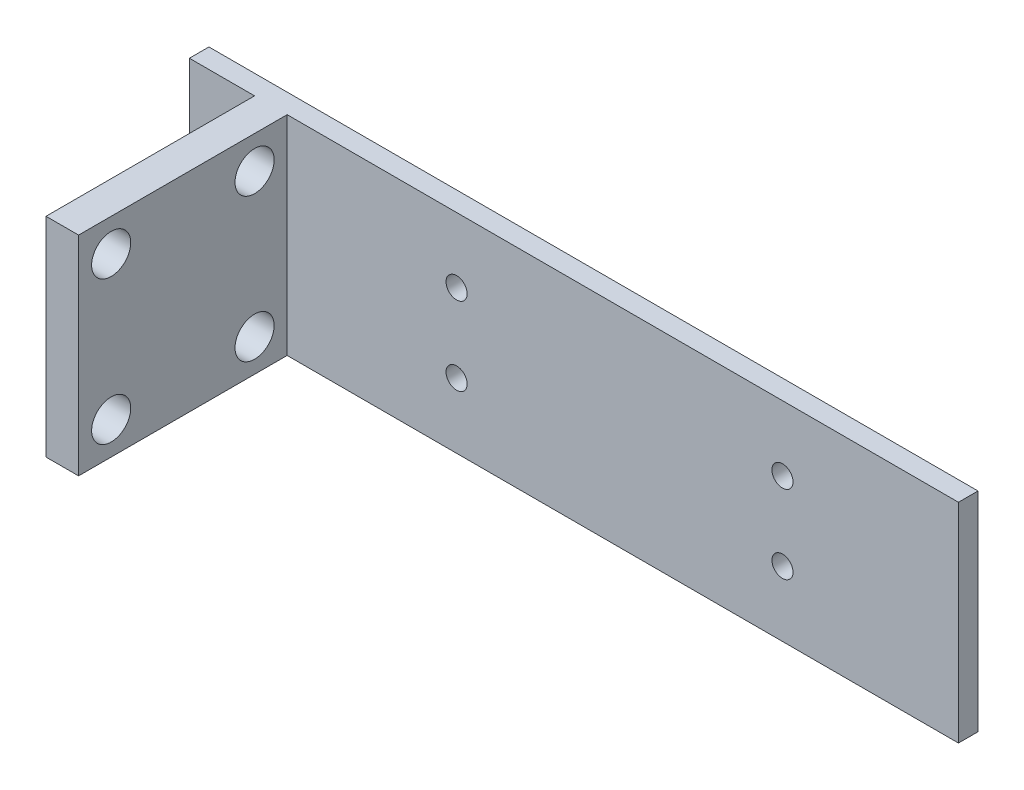
ISO-10303-21;
HEADER;
FILE_DESCRIPTION(('STEP AP214'),'2;1');
FILE_NAME('part.step','',(''),(''),'','','');
FILE_SCHEMA(('AUTOMOTIVE_DESIGN { 1 0 10303 214 1 1 1 1 }'));
ENDSEC;
DATA;
#1=APPLICATION_CONTEXT('core data for automotive mechanical design processes');
#2=APPLICATION_PROTOCOL_DEFINITION('international standard','automotive_design',2000,#1);
#3=PRODUCT_CONTEXT('',#1,'mechanical');
#4=PRODUCT('Part','Part','',(#3));
#5=PRODUCT_RELATED_PRODUCT_CATEGORY('part','',(#4));
#6=PRODUCT_DEFINITION_FORMATION('','',#4);
#7=PRODUCT_DEFINITION_CONTEXT('part definition',#1,'design');
#8=PRODUCT_DEFINITION('design','',#6,#7);
#9=PRODUCT_DEFINITION_SHAPE('','',#8);
#10=(LENGTH_UNIT() NAMED_UNIT(*) SI_UNIT(.MILLI.,.METRE.));
#11=(NAMED_UNIT(*) PLANE_ANGLE_UNIT() SI_UNIT($,.RADIAN.));
#12=(NAMED_UNIT(*) SI_UNIT($,.STERADIAN.) SOLID_ANGLE_UNIT());
#13=UNCERTAINTY_MEASURE_WITH_UNIT(LENGTH_MEASURE(1.E-05),#10,'distance_accuracy_value','');
#14=(GEOMETRIC_REPRESENTATION_CONTEXT(3) GLOBAL_UNCERTAINTY_ASSIGNED_CONTEXT((#13)) GLOBAL_UNIT_ASSIGNED_CONTEXT((#10,
#11,#12)) REPRESENTATION_CONTEXT('',''));
#15=CARTESIAN_POINT('',(0.,0.,0.));
#16=DIRECTION('',(0.,0.,1.));
#17=DIRECTION('',(1.,0.,0.));
#18=AXIS2_PLACEMENT_3D('',#15,#16,#17);
#19=CARTESIAN_POINT('',(0.,0.,3.));
#20=DIRECTION('',(0.,0.,1.));
#21=DIRECTION('',(1.,0.,0.));
#22=AXIS2_PLACEMENT_3D('',#19,#20,#21);
#23=PLANE('',#22);
#24=DIRECTION('',(0.,-1.,0.));
#25=VECTOR('',#24,1.);
#26=CARTESIAN_POINT('',(-61.2816326530612,22.7170068027211,3.));
#27=LINE('',#26,#25);
#28=CARTESIAN_POINT('',(-61.2816326530612,22.7170068027211,3.));
#29=VERTEX_POINT('',#28);
#30=CARTESIAN_POINT('',(-61.2816326530612,-9.28299319727892,3.));
#31=VERTEX_POINT('',#30);
#32=EDGE_CURVE('E58',#29,#31,#27,.T.);
#33=ORIENTED_EDGE('',*,*,#32,.F.);
#34=DIRECTION('',(-1.,0.,0.));
#35=VECTOR('',#34,1.);
#36=CARTESIAN_POINT('',(-71.2816326530612,22.7170068027211,3.));
#37=LINE('',#36,#35);
#38=CARTESIAN_POINT('',(-71.2816326530612,22.7170068027211,3.));
#39=VERTEX_POINT('',#38);
#40=EDGE_CURVE('E168',#29,#39,#37,.T.);
#41=ORIENTED_EDGE('',*,*,#40,.T.);
#42=DIRECTION('',(0.,-1.,0.));
#43=VECTOR('',#42,1.);
#44=CARTESIAN_POINT('',(-71.2816326530612,22.7170068027211,3.));
#45=LINE('',#44,#43);
#46=CARTESIAN_POINT('',(-71.2816326530612,-9.28299319727892,3.));
#47=VERTEX_POINT('',#46);
#48=EDGE_CURVE('E159',#39,#47,#45,.T.);
#49=ORIENTED_EDGE('',*,*,#48,.T.);
#50=DIRECTION('',(1.,0.,0.));
#51=VECTOR('',#50,1.);
#52=CARTESIAN_POINT('',(-71.2816326530612,-9.28299319727892,3.));
#53=LINE('',#52,#51);
#54=EDGE_CURVE('E164',#47,#31,#53,.T.);
#55=ORIENTED_EDGE('',*,*,#54,.T.);
#56=EDGE_LOOP('',(#33,#41,#49,#55));
#57=FACE_BOUND('',#56,.T.);
#58=ADVANCED_FACE('F41',(#57),#23,.T.);
#59=CARTESIAN_POINT('',(-71.2816326530612,22.7170068027211,3.));
#60=DIRECTION('',(1.,0.,0.));
#61=DIRECTION('',(0.,0.,-1.));
#62=AXIS2_PLACEMENT_3D('',#59,#60,#61);
#63=PLANE('',#62);
#64=DIRECTION('',(0.,-1.,0.));
#65=VECTOR('',#64,1.);
#66=CARTESIAN_POINT('',(-71.2816326530612,22.7170068027211,0.));
#67=LINE('',#66,#65);
#68=CARTESIAN_POINT('',(-71.2816326530612,22.7170068027211,0.));
#69=VERTEX_POINT('',#68);
#70=CARTESIAN_POINT('',(-71.2816326530612,-9.28299319727892,0.));
#71=VERTEX_POINT('',#70);
#72=EDGE_CURVE('E156',#69,#71,#67,.T.);
#73=ORIENTED_EDGE('',*,*,#72,.T.);
#74=DIRECTION('',(0.,0.,-1.));
#75=VECTOR('',#74,1.);
#76=CARTESIAN_POINT('',(-71.2816326530612,-9.28299319727892,3.));
#77=LINE('',#76,#75);
#78=EDGE_CURVE('E11',#47,#71,#77,.T.);
#79=ORIENTED_EDGE('',*,*,#78,.F.);
#80=ORIENTED_EDGE('',*,*,#48,.F.);
#81=DIRECTION('',(0.,0.,-1.));
#82=VECTOR('',#81,1.);
#83=CARTESIAN_POINT('',(-71.2816326530612,22.7170068027211,3.));
#84=LINE('',#83,#82);
#85=EDGE_CURVE('E171',#39,#69,#84,.T.);
#86=ORIENTED_EDGE('',*,*,#85,.T.);
#87=EDGE_LOOP('',(#73,#79,#80,#86));
#88=FACE_BOUND('',#87,.T.);
#89=ADVANCED_FACE('F43',(#88),#63,.F.);
#90=CARTESIAN_POINT('',(-71.2816326530612,-9.28299319727892,3.));
#91=DIRECTION('',(0.,1.,0.));
#92=DIRECTION('',(0.,0.,1.));
#93=AXIS2_PLACEMENT_3D('',#90,#91,#92);
#94=PLANE('',#93);
#95=DIRECTION('',(1.,0.,0.));
#96=VECTOR('',#95,1.);
#97=CARTESIAN_POINT('',(-71.2816326530612,-9.28299319727892,0.));
#98=LINE('',#97,#96);
#99=CARTESIAN_POINT('',(46.7183673469388,-9.28299319727892,0.));
#100=VERTEX_POINT('',#99);
#101=EDGE_CURVE('E174',#71,#100,#98,.T.);
#102=ORIENTED_EDGE('',*,*,#101,.T.);
#103=DIRECTION('',(0.,0.,-1.));
#104=VECTOR('',#103,1.);
#105=CARTESIAN_POINT('',(46.7183673469388,-9.28299319727892,3.));
#106=LINE('',#105,#104);
#107=CARTESIAN_POINT('',(46.7183673469388,-9.28299319727892,3.));
#108=VERTEX_POINT('',#107);
#109=EDGE_CURVE('E50',#108,#100,#106,.T.);
#110=ORIENTED_EDGE('',*,*,#109,.F.);
#111=CARTESIAN_POINT('',(-56.2816326530612,-9.28299319727892,3.));
#112=VERTEX_POINT('',#111);
#113=EDGE_CURVE('E162',#112,#108,#53,.T.);
#114=ORIENTED_EDGE('',*,*,#113,.F.);
#115=DIRECTION('',(0.,0.,-1.));
#116=VECTOR('',#115,1.);
#117=CARTESIAN_POINT('',(-56.2816326530612,-9.28299319727892,35.));
#118=LINE('',#117,#116);
#119=CARTESIAN_POINT('',(-56.2816326530612,-9.28299319727892,35.));
#120=VERTEX_POINT('',#119);
#121=EDGE_CURVE('E114',#120,#112,#118,.T.);
#122=ORIENTED_EDGE('',*,*,#121,.F.);
#123=DIRECTION('',(1.,0.,0.));
#124=VECTOR('',#123,1.);
#125=CARTESIAN_POINT('',(-61.2816326530612,-9.28299319727892,35.));
#126=LINE('',#125,#124);
#127=CARTESIAN_POINT('',(-61.2816326530612,-9.28299319727892,35.));
#128=VERTEX_POINT('',#127);
#129=EDGE_CURVE('E108',#128,#120,#126,.T.);
#130=ORIENTED_EDGE('',*,*,#129,.F.);
#131=DIRECTION('',(0.,0.,-1.));
#132=VECTOR('',#131,1.);
#133=CARTESIAN_POINT('',(-61.2816326530612,-9.28299319727892,35.));
#134=LINE('',#133,#132);
#135=EDGE_CURVE('E112',#128,#31,#134,.T.);
#136=ORIENTED_EDGE('',*,*,#135,.T.);
#137=ORIENTED_EDGE('',*,*,#54,.F.);
#138=ORIENTED_EDGE('',*,*,#78,.T.);
#139=EDGE_LOOP('',(#102,#110,#114,#122,#130,#136,#137,#138));
#140=FACE_BOUND('',#139,.T.);
#141=ADVANCED_FACE('F110',(#140),#94,.F.);
#142=CARTESIAN_POINT('',(46.7183673469388,22.7170068027211,3.));
#143=DIRECTION('',(-1.,0.,0.));
#144=DIRECTION('',(0.,0.,1.));
#145=AXIS2_PLACEMENT_3D('',#142,#143,#144);
#146=PLANE('',#145);
#147=DIRECTION('',(0.,1.,0.));
#148=VECTOR('',#147,1.);
#149=CARTESIAN_POINT('',(46.7183673469388,22.7170068027211,0.));
#150=LINE('',#149,#148);
#151=CARTESIAN_POINT('',(46.7183673469388,22.7170068027211,0.));
#152=VERTEX_POINT('',#151);
#153=EDGE_CURVE('E176',#100,#152,#150,.T.);
#154=ORIENTED_EDGE('',*,*,#153,.T.);
#155=DIRECTION('',(0.,0.,-1.));
#156=VECTOR('',#155,1.);
#157=CARTESIAN_POINT('',(46.7183673469388,22.7170068027211,3.));
#158=LINE('',#157,#156);
#159=CARTESIAN_POINT('',(46.7183673469388,22.7170068027211,3.));
#160=VERTEX_POINT('',#159);
#161=EDGE_CURVE('E181',#160,#152,#158,.T.);
#162=ORIENTED_EDGE('',*,*,#161,.F.);
#163=DIRECTION('',(0.,1.,0.));
#164=VECTOR('',#163,1.);
#165=CARTESIAN_POINT('',(46.7183673469388,22.7170068027211,3.));
#166=LINE('',#165,#164);
#167=EDGE_CURVE('E166',#108,#160,#166,.T.);
#168=ORIENTED_EDGE('',*,*,#167,.F.);
#169=ORIENTED_EDGE('',*,*,#109,.T.);
#170=EDGE_LOOP('',(#154,#162,#168,#169));
#171=FACE_BOUND('',#170,.T.);
#172=ADVANCED_FACE('F254',(#171),#146,.F.);
#173=CARTESIAN_POINT('',(-71.2816326530612,22.7170068027211,3.));
#174=DIRECTION('',(0.,-1.,0.));
#175=DIRECTION('',(0.,0.,-1.));
#176=AXIS2_PLACEMENT_3D('',#173,#174,#175);
#177=PLANE('',#176);
#178=DIRECTION('',(-1.,0.,0.));
#179=VECTOR('',#178,1.);
#180=CARTESIAN_POINT('',(-71.2816326530612,22.7170068027211,0.));
#181=LINE('',#180,#179);
#182=EDGE_CURVE('E163',#152,#69,#181,.T.);
#183=ORIENTED_EDGE('',*,*,#182,.T.);
#184=ORIENTED_EDGE('',*,*,#85,.F.);
#185=ORIENTED_EDGE('',*,*,#40,.F.);
#186=DIRECTION('',(0.,0.,-1.));
#187=VECTOR('',#186,1.);
#188=CARTESIAN_POINT('',(-61.2816326530612,22.7170068027211,35.));
#189=LINE('',#188,#187);
#190=CARTESIAN_POINT('',(-61.2816326530612,22.7170068027211,35.));
#191=VERTEX_POINT('',#190);
#192=EDGE_CURVE('E211',#191,#29,#189,.T.);
#193=ORIENTED_EDGE('',*,*,#192,.F.);
#194=DIRECTION('',(-1.,0.,0.));
#195=VECTOR('',#194,1.);
#196=CARTESIAN_POINT('',(-61.2816326530612,22.7170068027211,35.));
#197=LINE('',#196,#195);
#198=CARTESIAN_POINT('',(-56.2816326530612,22.7170068027211,35.));
#199=VERTEX_POINT('',#198);
#200=EDGE_CURVE('E123',#199,#191,#197,.T.);
#201=ORIENTED_EDGE('',*,*,#200,.F.);
#202=DIRECTION('',(0.,0.,-1.));
#203=VECTOR('',#202,1.);
#204=CARTESIAN_POINT('',(-56.2816326530612,22.7170068027211,35.));
#205=LINE('',#204,#203);
#206=CARTESIAN_POINT('',(-56.2816326530612,22.7170068027211,3.));
#207=VERTEX_POINT('',#206);
#208=EDGE_CURVE('E134',#199,#207,#205,.T.);
#209=ORIENTED_EDGE('',*,*,#208,.T.);
#210=EDGE_CURVE('E169',#160,#207,#37,.T.);
#211=ORIENTED_EDGE('',*,*,#210,.F.);
#212=ORIENTED_EDGE('',*,*,#161,.T.);
#213=EDGE_LOOP('',(#183,#184,#185,#193,#201,#209,#211,#212));
#214=FACE_BOUND('',#213,.T.);
#215=ADVANCED_FACE('F218',(#214),#177,.F.);
#216=DIRECTION('',(0.,1.,0.));
#217=VECTOR('',#216,1.);
#218=CARTESIAN_POINT('',(-56.2816326530612,22.7170068027211,3.));
#219=LINE('',#218,#217);
#220=EDGE_CURVE('E66',#112,#207,#219,.T.);
#221=ORIENTED_EDGE('',*,*,#220,.F.);
#222=ORIENTED_EDGE('',*,*,#113,.T.);
#223=ORIENTED_EDGE('',*,*,#167,.T.);
#224=ORIENTED_EDGE('',*,*,#210,.T.);
#225=EDGE_LOOP('',(#221,#222,#223,#224));
#226=FACE_BOUND('',#225,.T.);
#227=CARTESIAN_POINT('',(-30.2816326530612,0.717006802721081,3.));
#228=DIRECTION('',(0.,0.,1.));
#229=DIRECTION('',(1.,0.,0.));
#230=AXIS2_PLACEMENT_3D('',#227,#228,#229);
#231=CIRCLE('',#230,1.62);
#232=CARTESIAN_POINT('',(-28.6616326530612,0.717006802721081,3.));
#233=VERTEX_POINT('',#232);
#234=EDGE_CURVE('E141',#233,#233,#231,.T.);
#235=ORIENTED_EDGE('',*,*,#234,.F.);
#236=EDGE_LOOP('',(#235));
#237=FACE_BOUND('',#236,.T.);
#238=CARTESIAN_POINT('',(19.7183673469388,12.7170068027211,3.));
#239=DIRECTION('',(0.,0.,1.));
#240=DIRECTION('',(1.,0.,0.));
#241=AXIS2_PLACEMENT_3D('',#238,#239,#240);
#242=CIRCLE('',#241,1.62);
#243=CARTESIAN_POINT('',(21.3383673469388,12.7170068027211,3.));
#244=VERTEX_POINT('',#243);
#245=EDGE_CURVE('E148',#244,#244,#242,.T.);
#246=ORIENTED_EDGE('',*,*,#245,.F.);
#247=EDGE_LOOP('',(#246));
#248=FACE_BOUND('',#247,.T.);
#249=CARTESIAN_POINT('',(19.7183673469388,0.717006802721081,3.));
#250=DIRECTION('',(0.,0.,1.));
#251=DIRECTION('',(1.,0.,0.));
#252=AXIS2_PLACEMENT_3D('',#249,#250,#251);
#253=CIRCLE('',#252,1.62);
#254=CARTESIAN_POINT('',(21.3383673469388,0.717006802721081,3.));
#255=VERTEX_POINT('',#254);
#256=EDGE_CURVE('E132',#255,#255,#253,.T.);
#257=ORIENTED_EDGE('',*,*,#256,.F.);
#258=EDGE_LOOP('',(#257));
#259=FACE_BOUND('',#258,.T.);
#260=CARTESIAN_POINT('',(-30.2816326530612,12.7170068027211,3.));
#261=DIRECTION('',(0.,0.,1.));
#262=DIRECTION('',(1.,0.,0.));
#263=AXIS2_PLACEMENT_3D('',#260,#261,#262);
#264=CIRCLE('',#263,1.62000000000001);
#265=CARTESIAN_POINT('',(-28.6616326530612,12.7170068027211,3.));
#266=VERTEX_POINT('',#265);
#267=EDGE_CURVE('E144',#266,#266,#264,.T.);
#268=ORIENTED_EDGE('',*,*,#267,.F.);
#269=EDGE_LOOP('',(#268));
#270=FACE_BOUND('',#269,.T.);
#271=ADVANCED_FACE('F237',(#226,#237,#248,#259,#270),#23,.T.);
#272=CARTESIAN_POINT('',(0.,0.,0.));
#273=DIRECTION('',(0.,0.,1.));
#274=DIRECTION('',(1.,0.,0.));
#275=AXIS2_PLACEMENT_3D('',#272,#273,#274);
#276=PLANE('',#275);
#277=CARTESIAN_POINT('',(-30.2816326530612,0.717006802721081,0.));
#278=DIRECTION('',(0.,0.,1.));
#279=DIRECTION('',(1.,0.,0.));
#280=AXIS2_PLACEMENT_3D('',#277,#278,#279);
#281=CIRCLE('',#280,1.62);
#282=CARTESIAN_POINT('',(-28.6616326530612,0.717006802721081,0.));
#283=VERTEX_POINT('',#282);
#284=EDGE_CURVE('E145',#283,#283,#281,.T.);
#285=ORIENTED_EDGE('',*,*,#284,.T.);
#286=EDGE_LOOP('',(#285));
#287=FACE_BOUND('',#286,.T.);
#288=CARTESIAN_POINT('',(19.7183673469388,12.7170068027211,0.));
#289=DIRECTION('',(0.,0.,1.));
#290=DIRECTION('',(1.,0.,0.));
#291=AXIS2_PLACEMENT_3D('',#288,#289,#290);
#292=CIRCLE('',#291,1.62);
#293=CARTESIAN_POINT('',(21.3383673469388,12.7170068027211,0.));
#294=VERTEX_POINT('',#293);
#295=EDGE_CURVE('E139',#294,#294,#292,.T.);
#296=ORIENTED_EDGE('',*,*,#295,.T.);
#297=EDGE_LOOP('',(#296));
#298=FACE_BOUND('',#297,.T.);
#299=CARTESIAN_POINT('',(19.7183673469388,0.717006802721081,0.));
#300=DIRECTION('',(0.,0.,1.));
#301=DIRECTION('',(1.,0.,0.));
#302=AXIS2_PLACEMENT_3D('',#299,#300,#301);
#303=CIRCLE('',#302,1.62);
#304=CARTESIAN_POINT('',(21.3383673469388,0.717006802721081,0.));
#305=VERTEX_POINT('',#304);
#306=EDGE_CURVE('E129',#305,#305,#303,.T.);
#307=ORIENTED_EDGE('',*,*,#306,.T.);
#308=EDGE_LOOP('',(#307));
#309=FACE_BOUND('',#308,.T.);
#310=CARTESIAN_POINT('',(-30.2816326530612,12.7170068027211,0.));
#311=DIRECTION('',(0.,0.,1.));
#312=DIRECTION('',(1.,0.,0.));
#313=AXIS2_PLACEMENT_3D('',#310,#311,#312);
#314=CIRCLE('',#313,1.62000000000001);
#315=CARTESIAN_POINT('',(-28.6616326530612,12.7170068027211,0.));
#316=VERTEX_POINT('',#315);
#317=EDGE_CURVE('E153',#316,#316,#314,.T.);
#318=ORIENTED_EDGE('',*,*,#317,.T.);
#319=EDGE_LOOP('',(#318));
#320=FACE_BOUND('',#319,.T.);
#321=ORIENTED_EDGE('',*,*,#72,.F.);
#322=ORIENTED_EDGE('',*,*,#182,.F.);
#323=ORIENTED_EDGE('',*,*,#153,.F.);
#324=ORIENTED_EDGE('',*,*,#101,.F.);
#325=EDGE_LOOP('',(#321,#322,#323,#324));
#326=FACE_BOUND('',#325,.T.);
#327=ADVANCED_FACE('F247',(#287,#298,#309,#320,#326),#276,.F.);
#328=CARTESIAN_POINT('',(-30.2816326530612,12.7170068027211,0.));
#329=DIRECTION('',(0.,0.,1.));
#330=DIRECTION('',(1.,0.,0.));
#331=AXIS2_PLACEMENT_3D('',#328,#329,#330);
#332=CYLINDRICAL_SURFACE('',#331,1.62000000000001);
#333=ORIENTED_EDGE('',*,*,#317,.F.);
#334=EDGE_LOOP('',(#333));
#335=FACE_BOUND('',#334,.T.);
#336=ORIENTED_EDGE('',*,*,#267,.T.);
#337=EDGE_LOOP('',(#336));
#338=FACE_BOUND('',#337,.T.);
#339=ADVANCED_FACE('F252',(#335,#338),#332,.F.);
#340=CARTESIAN_POINT('',(19.7183673469388,0.717006802721081,0.));
#341=DIRECTION('',(0.,0.,1.));
#342=DIRECTION('',(1.,0.,0.));
#343=AXIS2_PLACEMENT_3D('',#340,#341,#342);
#344=CYLINDRICAL_SURFACE('',#343,1.62);
#345=ORIENTED_EDGE('',*,*,#306,.F.);
#346=EDGE_LOOP('',(#345));
#347=FACE_BOUND('',#346,.T.);
#348=ORIENTED_EDGE('',*,*,#256,.T.);
#349=EDGE_LOOP('',(#348));
#350=FACE_BOUND('',#349,.T.);
#351=ADVANCED_FACE('F266',(#347,#350),#344,.F.);
#352=CARTESIAN_POINT('',(19.7183673469388,12.7170068027211,0.));
#353=DIRECTION('',(0.,0.,1.));
#354=DIRECTION('',(1.,0.,0.));
#355=AXIS2_PLACEMENT_3D('',#352,#353,#354);
#356=CYLINDRICAL_SURFACE('',#355,1.62);
#357=ORIENTED_EDGE('',*,*,#295,.F.);
#358=EDGE_LOOP('',(#357));
#359=FACE_BOUND('',#358,.T.);
#360=ORIENTED_EDGE('',*,*,#245,.T.);
#361=EDGE_LOOP('',(#360));
#362=FACE_BOUND('',#361,.T.);
#363=ADVANCED_FACE('F271',(#359,#362),#356,.F.);
#364=CARTESIAN_POINT('',(-30.2816326530612,0.717006802721081,0.));
#365=DIRECTION('',(0.,0.,1.));
#366=DIRECTION('',(1.,0.,0.));
#367=AXIS2_PLACEMENT_3D('',#364,#365,#366);
#368=CYLINDRICAL_SURFACE('',#367,1.62);
#369=ORIENTED_EDGE('',*,*,#284,.F.);
#370=EDGE_LOOP('',(#369));
#371=FACE_BOUND('',#370,.T.);
#372=ORIENTED_EDGE('',*,*,#234,.T.);
#373=EDGE_LOOP('',(#372));
#374=FACE_BOUND('',#373,.T.);
#375=ADVANCED_FACE('F231',(#371,#374),#368,.F.);
#376=CARTESIAN_POINT('',(-61.2816326530612,22.7170068027211,35.));
#377=DIRECTION('',(1.,0.,0.));
#378=DIRECTION('',(0.,0.,-1.));
#379=AXIS2_PLACEMENT_3D('',#376,#377,#378);
#380=PLANE('',#379);
#381=CARTESIAN_POINT('',(-61.2816326530612,-4.28299319727892,30.));
#382=DIRECTION('',(1.,0.,0.));
#383=DIRECTION('',(0.,0.,-1.));
#384=AXIS2_PLACEMENT_3D('',#381,#382,#383);
#385=CIRCLE('',#384,3.);
#386=CARTESIAN_POINT('',(-61.2816326530612,-4.28299319727892,27.));
#387=VERTEX_POINT('',#386);
#388=EDGE_CURVE('E206',#387,#387,#385,.T.);
#389=ORIENTED_EDGE('',*,*,#388,.T.);
#390=EDGE_LOOP('',(#389));
#391=FACE_BOUND('',#390,.T.);
#392=CARTESIAN_POINT('',(-61.2816326530612,17.7170068027211,8.));
#393=DIRECTION('',(1.,0.,0.));
#394=DIRECTION('',(0.,0.,-1.));
#395=AXIS2_PLACEMENT_3D('',#392,#393,#394);
#396=CIRCLE('',#395,3.);
#397=CARTESIAN_POINT('',(-61.2816326530612,17.7170068027211,5.));
#398=VERTEX_POINT('',#397);
#399=EDGE_CURVE('E195',#398,#398,#396,.T.);
#400=ORIENTED_EDGE('',*,*,#399,.T.);
#401=EDGE_LOOP('',(#400));
#402=FACE_BOUND('',#401,.T.);
#403=CARTESIAN_POINT('',(-61.2816326530612,-4.28299319727892,8.));
#404=DIRECTION('',(1.,0.,0.));
#405=DIRECTION('',(0.,0.,-1.));
#406=AXIS2_PLACEMENT_3D('',#403,#404,#405);
#407=CIRCLE('',#406,3.);
#408=CARTESIAN_POINT('',(-61.2816326530612,-4.28299319727892,5.));
#409=VERTEX_POINT('',#408);
#410=EDGE_CURVE('E192',#409,#409,#407,.T.);
#411=ORIENTED_EDGE('',*,*,#410,.T.);
#412=EDGE_LOOP('',(#411));
#413=FACE_BOUND('',#412,.T.);
#414=CARTESIAN_POINT('',(-61.2816326530612,17.7170068027211,30.));
#415=DIRECTION('',(1.,0.,0.));
#416=DIRECTION('',(0.,0.,-1.));
#417=AXIS2_PLACEMENT_3D('',#414,#415,#416);
#418=CIRCLE('',#417,3.);
#419=CARTESIAN_POINT('',(-61.2816326530612,17.7170068027211,27.));
#420=VERTEX_POINT('',#419);
#421=EDGE_CURVE('E189',#420,#420,#418,.T.);
#422=ORIENTED_EDGE('',*,*,#421,.T.);
#423=EDGE_LOOP('',(#422));
#424=FACE_BOUND('',#423,.T.);
#425=ORIENTED_EDGE('',*,*,#32,.T.);
#426=ORIENTED_EDGE('',*,*,#135,.F.);
#427=DIRECTION('',(0.,-1.,0.));
#428=VECTOR('',#427,1.);
#429=CARTESIAN_POINT('',(-61.2816326530612,22.7170068027211,35.));
#430=LINE('',#429,#428);
#431=EDGE_CURVE('E118',#191,#128,#430,.T.);
#432=ORIENTED_EDGE('',*,*,#431,.F.);
#433=ORIENTED_EDGE('',*,*,#192,.T.);
#434=EDGE_LOOP('',(#425,#426,#432,#433));
#435=FACE_BOUND('',#434,.T.);
#436=ADVANCED_FACE('F128',(#391,#402,#413,#424,#435),#380,.F.);
#437=CARTESIAN_POINT('',(-56.2816326530612,22.7170068027211,35.));
#438=DIRECTION('',(-1.,0.,0.));
#439=DIRECTION('',(0.,0.,1.));
#440=AXIS2_PLACEMENT_3D('',#437,#438,#439);
#441=PLANE('',#440);
#442=CARTESIAN_POINT('',(-56.2816326530612,-4.28299319727892,30.));
#443=DIRECTION('',(-1.,0.,0.));
#444=DIRECTION('',(0.,0.,1.));
#445=AXIS2_PLACEMENT_3D('',#442,#443,#444);
#446=CIRCLE('',#445,3.);
#447=CARTESIAN_POINT('',(-56.2816326530612,-4.28299319727892,33.));
#448=VERTEX_POINT('',#447);
#449=EDGE_CURVE('E45',#448,#448,#446,.T.);
#450=ORIENTED_EDGE('',*,*,#449,.T.);
#451=EDGE_LOOP('',(#450));
#452=FACE_BOUND('',#451,.T.);
#453=CARTESIAN_POINT('',(-56.2816326530612,17.7170068027211,8.));
#454=DIRECTION('',(-1.,0.,0.));
#455=DIRECTION('',(0.,0.,1.));
#456=AXIS2_PLACEMENT_3D('',#453,#454,#455);
#457=CIRCLE('',#456,3.);
#458=CARTESIAN_POINT('',(-56.2816326530612,17.7170068027211,11.));
#459=VERTEX_POINT('',#458);
#460=EDGE_CURVE('E193',#459,#459,#457,.T.);
#461=ORIENTED_EDGE('',*,*,#460,.T.);
#462=EDGE_LOOP('',(#461));
#463=FACE_BOUND('',#462,.T.);
#464=CARTESIAN_POINT('',(-56.2816326530612,-4.28299319727892,8.));
#465=DIRECTION('',(-1.,0.,0.));
#466=DIRECTION('',(0.,0.,1.));
#467=AXIS2_PLACEMENT_3D('',#464,#465,#466);
#468=CIRCLE('',#467,3.);
#469=CARTESIAN_POINT('',(-56.2816326530612,-4.28299319727892,11.));
#470=VERTEX_POINT('',#469);
#471=EDGE_CURVE('E190',#470,#470,#468,.T.);
#472=ORIENTED_EDGE('',*,*,#471,.T.);
#473=EDGE_LOOP('',(#472));
#474=FACE_BOUND('',#473,.T.);
#475=CARTESIAN_POINT('',(-56.2816326530612,17.7170068027211,30.));
#476=DIRECTION('',(-1.,0.,0.));
#477=DIRECTION('',(0.,0.,1.));
#478=AXIS2_PLACEMENT_3D('',#475,#476,#477);
#479=CIRCLE('',#478,3.);
#480=CARTESIAN_POINT('',(-56.2816326530612,17.7170068027211,33.));
#481=VERTEX_POINT('',#480);
#482=EDGE_CURVE('E186',#481,#481,#479,.T.);
#483=ORIENTED_EDGE('',*,*,#482,.T.);
#484=EDGE_LOOP('',(#483));
#485=FACE_BOUND('',#484,.T.);
#486=ORIENTED_EDGE('',*,*,#220,.T.);
#487=ORIENTED_EDGE('',*,*,#208,.F.);
#488=DIRECTION('',(0.,1.,0.));
#489=VECTOR('',#488,1.);
#490=CARTESIAN_POINT('',(-56.2816326530612,22.7170068027211,35.));
#491=LINE('',#490,#489);
#492=EDGE_CURVE('E117',#120,#199,#491,.T.);
#493=ORIENTED_EDGE('',*,*,#492,.F.);
#494=ORIENTED_EDGE('',*,*,#121,.T.);
#495=EDGE_LOOP('',(#486,#487,#493,#494));
#496=FACE_BOUND('',#495,.T.);
#497=ADVANCED_FACE('F220',(#452,#463,#474,#485,#496),#441,.F.);
#498=CARTESIAN_POINT('',(0.,0.,35.));
#499=DIRECTION('',(0.,0.,1.));
#500=DIRECTION('',(1.,0.,0.));
#501=AXIS2_PLACEMENT_3D('',#498,#499,#500);
#502=PLANE('',#501);
#503=ORIENTED_EDGE('',*,*,#431,.T.);
#504=ORIENTED_EDGE('',*,*,#129,.T.);
#505=ORIENTED_EDGE('',*,*,#492,.T.);
#506=ORIENTED_EDGE('',*,*,#200,.T.);
#507=EDGE_LOOP('',(#503,#504,#505,#506));
#508=FACE_BOUND('',#507,.T.);
#509=ADVANCED_FACE('F121',(#508),#502,.T.);
#510=CARTESIAN_POINT('',(-39.2816326530612,17.7170068027211,30.));
#511=DIRECTION('',(-1.,0.,0.));
#512=DIRECTION('',(0.,0.,1.));
#513=AXIS2_PLACEMENT_3D('',#510,#511,#512);
#514=CYLINDRICAL_SURFACE('',#513,3.);
#515=ORIENTED_EDGE('',*,*,#482,.F.);
#516=EDGE_LOOP('',(#515));
#517=FACE_BOUND('',#516,.T.);
#518=ORIENTED_EDGE('',*,*,#421,.F.);
#519=EDGE_LOOP('',(#518));
#520=FACE_BOUND('',#519,.T.);
#521=ADVANCED_FACE('F229',(#517,#520),#514,.F.);
#522=CARTESIAN_POINT('',(-39.2816326530612,-4.28299319727892,8.));
#523=DIRECTION('',(-1.,0.,0.));
#524=DIRECTION('',(0.,0.,1.));
#525=AXIS2_PLACEMENT_3D('',#522,#523,#524);
#526=CYLINDRICAL_SURFACE('',#525,3.);
#527=ORIENTED_EDGE('',*,*,#471,.F.);
#528=EDGE_LOOP('',(#527));
#529=FACE_BOUND('',#528,.T.);
#530=ORIENTED_EDGE('',*,*,#410,.F.);
#531=EDGE_LOOP('',(#530));
#532=FACE_BOUND('',#531,.T.);
#533=ADVANCED_FACE('F339',(#529,#532),#526,.F.);
#534=CARTESIAN_POINT('',(-39.2816326530612,17.7170068027211,8.));
#535=DIRECTION('',(-1.,0.,0.));
#536=DIRECTION('',(0.,0.,1.));
#537=AXIS2_PLACEMENT_3D('',#534,#535,#536);
#538=CYLINDRICAL_SURFACE('',#537,3.);
#539=ORIENTED_EDGE('',*,*,#460,.F.);
#540=EDGE_LOOP('',(#539));
#541=FACE_BOUND('',#540,.T.);
#542=ORIENTED_EDGE('',*,*,#399,.F.);
#543=EDGE_LOOP('',(#542));
#544=FACE_BOUND('',#543,.T.);
#545=ADVANCED_FACE('F349',(#541,#544),#538,.F.);
#546=CARTESIAN_POINT('',(-39.2816326530612,-4.28299319727892,30.));
#547=DIRECTION('',(-1.,0.,0.));
#548=DIRECTION('',(0.,0.,1.));
#549=AXIS2_PLACEMENT_3D('',#546,#547,#548);
#550=CYLINDRICAL_SURFACE('',#549,3.);
#551=ORIENTED_EDGE('',*,*,#449,.F.);
#552=EDGE_LOOP('',(#551));
#553=FACE_BOUND('',#552,.T.);
#554=ORIENTED_EDGE('',*,*,#388,.F.);
#555=EDGE_LOOP('',(#554));
#556=FACE_BOUND('',#555,.T.);
#557=ADVANCED_FACE('F359',(#553,#556),#550,.F.);
#558=CLOSED_SHELL('',(#58,#89,#141,#172,#215,#271,#327,#339,#351,#363,#375,#436,#497,#509,#521,
#533,#545,#557));
#559=MANIFOLD_SOLID_BREP('B2',#558);
#560=ADVANCED_BREP_SHAPE_REPRESENTATION('',(#18,#559),#14);
#561=SHAPE_DEFINITION_REPRESENTATION(#9,#560);
ENDSEC;
END-ISO-10303-21;
